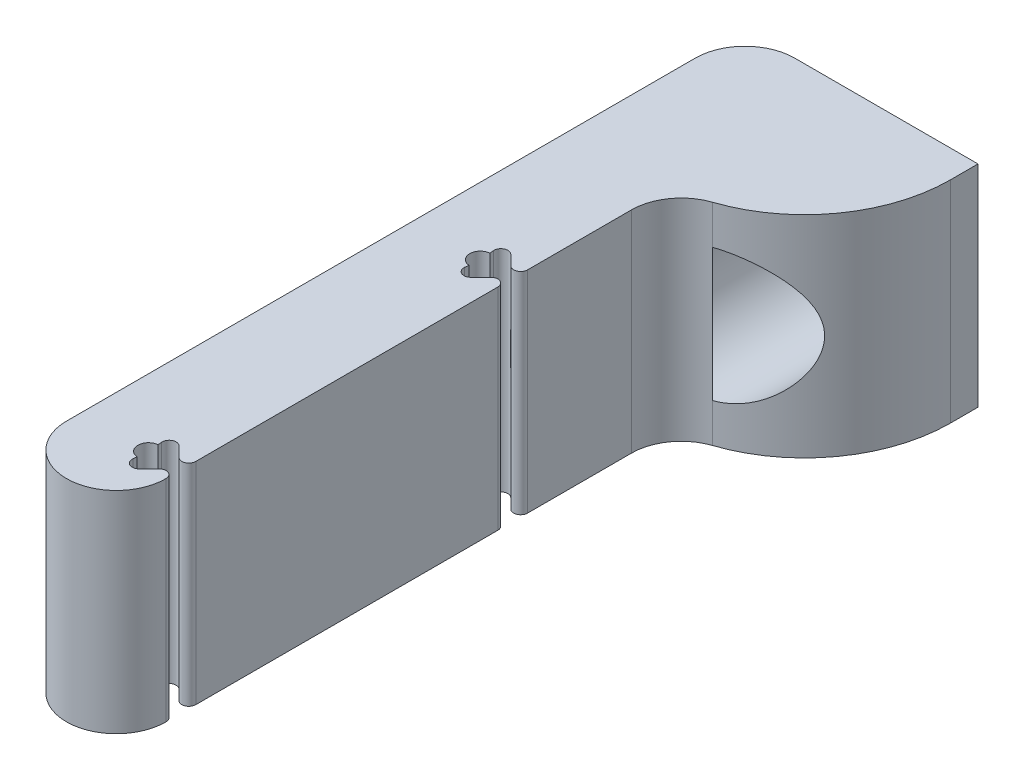
ISO-10303-21;
HEADER;
FILE_DESCRIPTION(('STEP AP214'),'2;1');
FILE_NAME('part.step','',(''),(''),'','','');
FILE_SCHEMA(('AUTOMOTIVE_DESIGN { 1 0 10303 214 1 1 1 1 }'));
ENDSEC;
DATA;
#1=APPLICATION_CONTEXT('core data for automotive mechanical design processes');
#2=APPLICATION_PROTOCOL_DEFINITION('international standard','automotive_design',2000,#1);
#3=PRODUCT_CONTEXT('',#1,'mechanical');
#4=PRODUCT('Part','Part','',(#3));
#5=PRODUCT_RELATED_PRODUCT_CATEGORY('part','',(#4));
#6=PRODUCT_DEFINITION_FORMATION('','',#4);
#7=PRODUCT_DEFINITION_CONTEXT('part definition',#1,'design');
#8=PRODUCT_DEFINITION('design','',#6,#7);
#9=PRODUCT_DEFINITION_SHAPE('','',#8);
#10=(LENGTH_UNIT() NAMED_UNIT(*) SI_UNIT(.MILLI.,.METRE.));
#11=(NAMED_UNIT(*) PLANE_ANGLE_UNIT() SI_UNIT($,.RADIAN.));
#12=(NAMED_UNIT(*) SI_UNIT($,.STERADIAN.) SOLID_ANGLE_UNIT());
#13=UNCERTAINTY_MEASURE_WITH_UNIT(LENGTH_MEASURE(1.E-05),#10,'distance_accuracy_value','');
#14=(GEOMETRIC_REPRESENTATION_CONTEXT(3) GLOBAL_UNCERTAINTY_ASSIGNED_CONTEXT((#13)) GLOBAL_UNIT_ASSIGNED_CONTEXT((#10,
#11,#12)) REPRESENTATION_CONTEXT('',''));
#15=CARTESIAN_POINT('',(0.,0.,0.));
#16=DIRECTION('',(0.,0.,1.));
#17=DIRECTION('',(1.,0.,0.));
#18=AXIS2_PLACEMENT_3D('',#15,#16,#17);
#19=CARTESIAN_POINT('',(-4.,12.7,0.));
#20=DIRECTION('',(0.,-1.,0.));
#21=DIRECTION('',(0.,0.,-1.));
#22=AXIS2_PLACEMENT_3D('',#19,#20,#21);
#23=CYLINDRICAL_SURFACE('',#22,0.635);
#24=CARTESIAN_POINT('',(-4.,0.,0.));
#25=DIRECTION('',(0.,-1.,0.));
#26=DIRECTION('',(0.,0.,1.));
#27=AXIS2_PLACEMENT_3D('',#24,#25,#26);
#28=CIRCLE('',#27,0.635);
#29=CARTESIAN_POINT('',(-4.05534389664477,0.,0.632583633288259));
#30=VERTEX_POINT('',#29);
#31=CARTESIAN_POINT('',(-4.05534389664477,0.,-0.632583633288257));
#32=VERTEX_POINT('',#31);
#33=EDGE_CURVE('E263',#30,#32,#28,.T.);
#34=ORIENTED_EDGE('',*,*,#33,.T.);
#35=DIRECTION('',(0.,-1.,0.));
#36=VECTOR('',#35,1.);
#37=CARTESIAN_POINT('',(-4.05534389664477,12.7,-0.632583633288257));
#38=LINE('',#37,#36);
#39=CARTESIAN_POINT('',(-4.05534389664477,12.7,-0.632583633288257));
#40=VERTEX_POINT('',#39);
#41=EDGE_CURVE('E11',#40,#32,#38,.T.);
#42=ORIENTED_EDGE('',*,*,#41,.F.);
#43=CARTESIAN_POINT('',(-4.,12.7,0.));
#44=DIRECTION('',(0.,-1.,0.));
#45=DIRECTION('',(0.,0.,1.));
#46=AXIS2_PLACEMENT_3D('',#43,#44,#45);
#47=CIRCLE('',#46,0.635);
#48=CARTESIAN_POINT('',(-4.05534389664477,12.7,0.632583633288259));
#49=VERTEX_POINT('',#48);
#50=EDGE_CURVE('E345',#49,#40,#47,.T.);
#51=ORIENTED_EDGE('',*,*,#50,.F.);
#52=DIRECTION('',(0.,-1.,0.));
#53=VECTOR('',#52,1.);
#54=CARTESIAN_POINT('',(-4.05534389664477,12.7,0.632583633288259));
#55=LINE('',#54,#53);
#56=EDGE_CURVE('E259',#49,#30,#55,.T.);
#57=ORIENTED_EDGE('',*,*,#56,.T.);
#58=EDGE_LOOP('',(#34,#42,#51,#57));
#59=FACE_BOUND('',#58,.T.);
#60=ADVANCED_FACE('F39',(#59),#23,.F.);
#61=CARTESIAN_POINT('',(-4.05534389664477,12.7,-0.632583633288257));
#62=DIRECTION('',(-0.996194698091745,0.,0.0871557427476669));
#63=DIRECTION('',(0.0871557427476669,0.,0.996194698091745));
#64=AXIS2_PLACEMENT_3D('',#61,#62,#63);
#65=PLANE('',#64);
#66=DIRECTION('',(-0.087155742747667,0.,-0.996194698091745));
#67=VECTOR('',#66,1.);
#68=CARTESIAN_POINT('',(-4.05534389664477,0.,-0.632583633288257));
#69=LINE('',#68,#67);
#70=CARTESIAN_POINT('',(-4.07584445948414,0.,-0.866906138778301));
#71=VERTEX_POINT('',#70);
#72=EDGE_CURVE('E267',#32,#71,#69,.T.);
#73=ORIENTED_EDGE('',*,*,#72,.T.);
#74=DIRECTION('',(0.,-1.,0.));
#75=VECTOR('',#74,1.);
#76=CARTESIAN_POINT('',(-4.07584445948414,12.7,-0.866906138778301));
#77=LINE('',#76,#75);
#78=CARTESIAN_POINT('',(-4.07584445948414,12.7,-0.866906138778301));
#79=VERTEX_POINT('',#78);
#80=EDGE_CURVE('E47',#79,#71,#77,.T.);
#81=ORIENTED_EDGE('',*,*,#80,.F.);
#82=DIRECTION('',(-0.087155742747667,0.,-0.996194698091745));
#83=VECTOR('',#82,1.);
#84=CARTESIAN_POINT('',(-4.05534389664477,12.7,-0.632583633288257));
#85=LINE('',#84,#83);
#86=EDGE_CURVE('E160',#40,#79,#85,.T.);
#87=ORIENTED_EDGE('',*,*,#86,.F.);
#88=ORIENTED_EDGE('',*,*,#41,.T.);
#89=EDGE_LOOP('',(#73,#81,#87,#88));
#90=FACE_BOUND('',#89,.T.);
#91=ADVANCED_FACE('F598',(#90),#65,.F.);
#92=CARTESIAN_POINT('',(-3.65806528884882,12.7,-0.903457080066158));
#93=DIRECTION('',(0.,-1.,0.));
#94=DIRECTION('',(0.,0.,-1.));
#95=AXIS2_PLACEMENT_3D('',#92,#93,#94);
#96=CYLINDRICAL_SURFACE('',#95,0.419375019196146);
#97=CARTESIAN_POINT('',(-3.65806528884882,0.,-0.903457080066158));
#98=DIRECTION('',(0.,-1.,0.));
#99=DIRECTION('',(0.,0.,-1.));
#100=AXIS2_PLACEMENT_3D('',#97,#98,#99);
#101=CIRCLE('',#100,0.419375019196146);
#102=CARTESIAN_POINT('',(-3.36152236891499,0.,-1.2));
#103=VERTEX_POINT('',#102);
#104=EDGE_CURVE('E271',#71,#103,#101,.T.);
#105=ORIENTED_EDGE('',*,*,#104,.T.);
#106=DIRECTION('',(0.,-1.,0.));
#107=VECTOR('',#106,1.);
#108=CARTESIAN_POINT('',(-3.36152236891499,12.7,-1.2));
#109=LINE('',#108,#107);
#110=CARTESIAN_POINT('',(-3.36152236891499,12.7,-1.2));
#111=VERTEX_POINT('',#110);
#112=EDGE_CURVE('E434',#111,#103,#109,.T.);
#113=ORIENTED_EDGE('',*,*,#112,.F.);
#114=CARTESIAN_POINT('',(-3.65806528884882,12.7,-0.903457080066158));
#115=DIRECTION('',(0.,-1.,0.));
#116=DIRECTION('',(0.,0.,-1.));
#117=AXIS2_PLACEMENT_3D('',#114,#115,#116);
#118=CIRCLE('',#117,0.419375019196146);
#119=EDGE_CURVE('E444',#79,#111,#118,.T.);
#120=ORIENTED_EDGE('',*,*,#119,.F.);
#121=ORIENTED_EDGE('',*,*,#80,.T.);
#122=EDGE_LOOP('',(#105,#113,#120,#121));
#123=FACE_BOUND('',#122,.T.);
#124=ADVANCED_FACE('F442',(#123),#96,.F.);
#125=CARTESIAN_POINT('',(-3.36152236891499,12.7,-1.2));
#126=DIRECTION('',(0.707106781186529,0.,-0.707106781186566));
#127=DIRECTION('',(-0.707106781186566,0.,-0.707106781186529));
#128=AXIS2_PLACEMENT_3D('',#125,#126,#127);
#129=PLANE('',#128);
#130=DIRECTION('',(0.707106781186566,0.,0.707106781186529));
#131=VECTOR('',#130,1.);
#132=CARTESIAN_POINT('',(-3.36152236891499,0.,-1.2));
#133=LINE('',#132,#131);
#134=CARTESIAN_POINT('',(-2.76152236891496,0.,-0.6));
#135=VERTEX_POINT('',#134);
#136=EDGE_CURVE('E274',#103,#135,#133,.T.);
#137=ORIENTED_EDGE('',*,*,#136,.T.);
#138=DIRECTION('',(0.,-1.,0.));
#139=VECTOR('',#138,1.);
#140=CARTESIAN_POINT('',(-2.76152236891496,12.7,-0.6));
#141=LINE('',#140,#139);
#142=CARTESIAN_POINT('',(-2.76152236891496,12.7,-0.6));
#143=VERTEX_POINT('',#142);
#144=EDGE_CURVE('E430',#143,#135,#141,.T.);
#145=ORIENTED_EDGE('',*,*,#144,.F.);
#146=DIRECTION('',(0.707106781186566,0.,0.707106781186529));
#147=VECTOR('',#146,1.);
#148=CARTESIAN_POINT('',(-3.36152236891499,12.7,-1.2));
#149=LINE('',#148,#147);
#150=EDGE_CURVE('E463',#111,#143,#149,.T.);
#151=ORIENTED_EDGE('',*,*,#150,.F.);
#152=ORIENTED_EDGE('',*,*,#112,.T.);
#153=EDGE_LOOP('',(#137,#145,#151,#152));
#154=FACE_BOUND('',#153,.T.);
#155=ADVANCED_FACE('F453',(#154),#129,.F.);
#156=CARTESIAN_POINT('',(-2.46497944898113,12.7,-0.896542919933841));
#157=DIRECTION('',(0.,-1.,0.));
#158=DIRECTION('',(0.,0.,-1.));
#159=AXIS2_PLACEMENT_3D('',#156,#157,#158);
#160=CYLINDRICAL_SURFACE('',#159,0.419375019196148);
#161=CARTESIAN_POINT('',(-2.46497944898113,0.,-0.896542919933841));
#162=DIRECTION('',(0.,1.,0.));
#163=DIRECTION('',(0.,0.,1.));
#164=AXIS2_PLACEMENT_3D('',#161,#162,#163);
#165=CIRCLE('',#164,0.419375019196148);
#166=CARTESIAN_POINT('',(-2.04560442978499,0.,-0.896542919933841));
#167=VERTEX_POINT('',#166);
#168=EDGE_CURVE('E277',#135,#167,#165,.T.);
#169=ORIENTED_EDGE('',*,*,#168,.T.);
#170=DIRECTION('',(0.,-1.,0.));
#171=VECTOR('',#170,1.);
#172=CARTESIAN_POINT('',(-2.04560442978499,12.7,-0.896542919933841));
#173=LINE('',#172,#171);
#174=CARTESIAN_POINT('',(-2.04560442978499,12.7,-0.896542919933841));
#175=VERTEX_POINT('',#174);
#176=EDGE_CURVE('E426',#175,#167,#173,.T.);
#177=ORIENTED_EDGE('',*,*,#176,.F.);
#178=CARTESIAN_POINT('',(-2.46497944898113,12.7,-0.896542919933841));
#179=DIRECTION('',(0.,1.,0.));
#180=DIRECTION('',(0.,0.,1.));
#181=AXIS2_PLACEMENT_3D('',#178,#179,#180);
#182=CIRCLE('',#181,0.419375019196148);
#183=EDGE_CURVE('E459',#143,#175,#182,.T.);
#184=ORIENTED_EDGE('',*,*,#183,.F.);
#185=ORIENTED_EDGE('',*,*,#144,.T.);
#186=EDGE_LOOP('',(#169,#177,#184,#185));
#187=FACE_BOUND('',#186,.T.);
#188=ADVANCED_FACE('F457',(#187),#160,.T.);
#189=CARTESIAN_POINT('',(-2.04560442978506,12.7,-19.1034570800662));
#190=DIRECTION('',(-1.,0.,0.));
#191=DIRECTION('',(0.,0.,1.));
#192=AXIS2_PLACEMENT_3D('',#189,#190,#191);
#193=PLANE('',#192);
#194=DIRECTION('',(0.,0.,-1.));
#195=VECTOR('',#194,1.);
#196=CARTESIAN_POINT('',(-2.04560442978506,0.,-19.1034570800662));
#197=LINE('',#196,#195);
#198=CARTESIAN_POINT('',(-2.04560442978506,0.,-19.1034570800662));
#199=VERTEX_POINT('',#198);
#200=EDGE_CURVE('E280',#167,#199,#197,.T.);
#201=ORIENTED_EDGE('',*,*,#200,.T.);
#202=DIRECTION('',(0.,-1.,0.));
#203=VECTOR('',#202,1.);
#204=CARTESIAN_POINT('',(-2.04560442978506,12.7,-19.1034570800662));
#205=LINE('',#204,#203);
#206=CARTESIAN_POINT('',(-2.04560442978506,12.7,-19.1034570800662));
#207=VERTEX_POINT('',#206);
#208=EDGE_CURVE('E422',#207,#199,#205,.T.);
#209=ORIENTED_EDGE('',*,*,#208,.F.);
#210=DIRECTION('',(0.,0.,-1.));
#211=VECTOR('',#210,1.);
#212=CARTESIAN_POINT('',(-2.04560442978506,12.7,-19.1034570800662));
#213=LINE('',#212,#211);
#214=EDGE_CURVE('E462',#175,#207,#213,.T.);
#215=ORIENTED_EDGE('',*,*,#214,.F.);
#216=ORIENTED_EDGE('',*,*,#176,.T.);
#217=EDGE_LOOP('',(#201,#209,#215,#216));
#218=FACE_BOUND('',#217,.T.);
#219=ADVANCED_FACE('F611',(#218),#193,.F.);
#220=CARTESIAN_POINT('',(-2.4649794489812,12.7,-19.1034570800662));
#221=DIRECTION('',(0.,-1.,0.));
#222=DIRECTION('',(0.,0.,-1.));
#223=AXIS2_PLACEMENT_3D('',#220,#221,#222);
#224=CYLINDRICAL_SURFACE('',#223,0.419375019196147);
#225=CARTESIAN_POINT('',(-2.4649794489812,0.,-19.1034570800662));
#226=DIRECTION('',(0.,1.,0.));
#227=DIRECTION('',(0.,0.,-1.));
#228=AXIS2_PLACEMENT_3D('',#225,#226,#227);
#229=CIRCLE('',#228,0.419375019196147);
#230=CARTESIAN_POINT('',(-2.76152236891503,0.,-19.4));
#231=VERTEX_POINT('',#230);
#232=EDGE_CURVE('E283',#199,#231,#229,.T.);
#233=ORIENTED_EDGE('',*,*,#232,.T.);
#234=DIRECTION('',(0.,-1.,0.));
#235=VECTOR('',#234,1.);
#236=CARTESIAN_POINT('',(-2.76152236891503,12.7,-19.4));
#237=LINE('',#236,#235);
#238=CARTESIAN_POINT('',(-2.76152236891503,12.7,-19.4));
#239=VERTEX_POINT('',#238);
#240=EDGE_CURVE('E418',#239,#231,#237,.T.);
#241=ORIENTED_EDGE('',*,*,#240,.F.);
#242=CARTESIAN_POINT('',(-2.4649794489812,12.7,-19.1034570800662));
#243=DIRECTION('',(0.,1.,0.));
#244=DIRECTION('',(0.,0.,-1.));
#245=AXIS2_PLACEMENT_3D('',#242,#243,#244);
#246=CIRCLE('',#245,0.419375019196147);
#247=EDGE_CURVE('E467',#207,#239,#246,.T.);
#248=ORIENTED_EDGE('',*,*,#247,.F.);
#249=ORIENTED_EDGE('',*,*,#208,.T.);
#250=EDGE_LOOP('',(#233,#241,#248,#249));
#251=FACE_BOUND('',#250,.T.);
#252=ADVANCED_FACE('F614',(#251),#224,.T.);
#253=CARTESIAN_POINT('',(-3.36152236891506,12.7,-18.8));
#254=DIRECTION('',(0.70710678118653,0.,0.707106781186565));
#255=DIRECTION('',(0.707106781186565,0.,-0.70710678118653));
#256=AXIS2_PLACEMENT_3D('',#253,#254,#255);
#257=PLANE('',#256);
#258=DIRECTION('',(-0.707106781186565,0.,0.70710678118653));
#259=VECTOR('',#258,1.);
#260=CARTESIAN_POINT('',(-3.36152236891506,0.,-18.8));
#261=LINE('',#260,#259);
#262=CARTESIAN_POINT('',(-3.36152236891506,0.,-18.8));
#263=VERTEX_POINT('',#262);
#264=EDGE_CURVE('E286',#231,#263,#261,.T.);
#265=ORIENTED_EDGE('',*,*,#264,.T.);
#266=DIRECTION('',(0.,-1.,0.));
#267=VECTOR('',#266,1.);
#268=CARTESIAN_POINT('',(-3.36152236891506,12.7,-18.8));
#269=LINE('',#268,#267);
#270=CARTESIAN_POINT('',(-3.36152236891506,12.7,-18.8));
#271=VERTEX_POINT('',#270);
#272=EDGE_CURVE('E414',#271,#263,#269,.T.);
#273=ORIENTED_EDGE('',*,*,#272,.F.);
#274=DIRECTION('',(-0.707106781186565,0.,0.70710678118653));
#275=VECTOR('',#274,1.);
#276=CARTESIAN_POINT('',(-3.36152236891506,12.7,-18.8));
#277=LINE('',#276,#275);
#278=EDGE_CURVE('E474',#239,#271,#277,.T.);
#279=ORIENTED_EDGE('',*,*,#278,.F.);
#280=ORIENTED_EDGE('',*,*,#240,.T.);
#281=EDGE_LOOP('',(#265,#273,#279,#280));
#282=FACE_BOUND('',#281,.T.);
#283=ADVANCED_FACE('F618',(#282),#257,.F.);
#284=CARTESIAN_POINT('',(-3.65806528884889,12.7,-19.0965429199338));
#285=DIRECTION('',(0.,-1.,0.));
#286=DIRECTION('',(0.,0.,-1.));
#287=AXIS2_PLACEMENT_3D('',#284,#285,#286);
#288=CYLINDRICAL_SURFACE('',#287,0.419375019196147);
#289=CARTESIAN_POINT('',(-3.65806528884889,0.,-19.0965429199338));
#290=DIRECTION('',(0.,-1.,0.));
#291=DIRECTION('',(0.,0.,1.));
#292=AXIS2_PLACEMENT_3D('',#289,#290,#291);
#293=CIRCLE('',#292,0.419375019196147);
#294=CARTESIAN_POINT('',(-4.07584445948421,0.,-19.1330938612217));
#295=VERTEX_POINT('',#294);
#296=EDGE_CURVE('E289',#263,#295,#293,.T.);
#297=ORIENTED_EDGE('',*,*,#296,.T.);
#298=DIRECTION('',(0.,-1.,0.));
#299=VECTOR('',#298,1.);
#300=CARTESIAN_POINT('',(-4.07584445948421,12.7,-19.1330938612217));
#301=LINE('',#300,#299);
#302=CARTESIAN_POINT('',(-4.07584445948421,12.7,-19.1330938612217));
#303=VERTEX_POINT('',#302);
#304=EDGE_CURVE('E410',#303,#295,#301,.T.);
#305=ORIENTED_EDGE('',*,*,#304,.F.);
#306=CARTESIAN_POINT('',(-3.65806528884889,12.7,-19.0965429199338));
#307=DIRECTION('',(0.,-1.,0.));
#308=DIRECTION('',(0.,0.,1.));
#309=AXIS2_PLACEMENT_3D('',#306,#307,#308);
#310=CIRCLE('',#309,0.419375019196147);
#311=EDGE_CURVE('E477',#271,#303,#310,.T.);
#312=ORIENTED_EDGE('',*,*,#311,.F.);
#313=ORIENTED_EDGE('',*,*,#272,.T.);
#314=EDGE_LOOP('',(#297,#305,#312,#313));
#315=FACE_BOUND('',#314,.T.);
#316=ADVANCED_FACE('F622',(#315),#288,.F.);
#317=CARTESIAN_POINT('',(-4.05534389664484,12.7,-19.3674163667117));
#318=DIRECTION('',(-0.996194698091745,0.,-0.0871557427476669));
#319=DIRECTION('',(-0.0871557427476668,0.,0.996194698091745));
#320=AXIS2_PLACEMENT_3D('',#317,#318,#319);
#321=PLANE('',#320);
#322=DIRECTION('',(0.0871557427476668,0.,-0.996194698091745));
#323=VECTOR('',#322,1.);
#324=CARTESIAN_POINT('',(-4.05534389664484,0.,-19.3674163667117));
#325=LINE('',#324,#323);
#326=CARTESIAN_POINT('',(-4.05534389664484,0.,-19.3674163667117));
#327=VERTEX_POINT('',#326);
#328=EDGE_CURVE('E292',#295,#327,#325,.T.);
#329=ORIENTED_EDGE('',*,*,#328,.T.);
#330=DIRECTION('',(0.,-1.,0.));
#331=VECTOR('',#330,1.);
#332=CARTESIAN_POINT('',(-4.05534389664484,12.7,-19.3674163667117));
#333=LINE('',#332,#331);
#334=CARTESIAN_POINT('',(-4.05534389664484,12.7,-19.3674163667117));
#335=VERTEX_POINT('',#334);
#336=EDGE_CURVE('E406',#335,#327,#333,.T.);
#337=ORIENTED_EDGE('',*,*,#336,.F.);
#338=DIRECTION('',(0.0871557427476668,0.,-0.996194698091745));
#339=VECTOR('',#338,1.);
#340=CARTESIAN_POINT('',(-4.05534389664484,12.7,-19.3674163667117));
#341=LINE('',#340,#339);
#342=EDGE_CURVE('E480',#303,#335,#341,.T.);
#343=ORIENTED_EDGE('',*,*,#342,.F.);
#344=ORIENTED_EDGE('',*,*,#304,.T.);
#345=EDGE_LOOP('',(#329,#337,#343,#344));
#346=FACE_BOUND('',#345,.T.);
#347=ADVANCED_FACE('F626',(#346),#321,.F.);
#348=CARTESIAN_POINT('',(-4.00000000000007,12.7,-20.));
#349=DIRECTION('',(0.,-1.,0.));
#350=DIRECTION('',(0.,0.,-1.));
#351=AXIS2_PLACEMENT_3D('',#348,#349,#350);
#352=CYLINDRICAL_SURFACE('',#351,0.635);
#353=CARTESIAN_POINT('',(-4.00000000000007,0.,-20.));
#354=DIRECTION('',(0.,-1.,0.));
#355=DIRECTION('',(0.,0.,1.));
#356=AXIS2_PLACEMENT_3D('',#353,#354,#355);
#357=CIRCLE('',#356,0.635);
#358=CARTESIAN_POINT('',(-4.05534389664484,0.,-20.6325836332883));
#359=VERTEX_POINT('',#358);
#360=EDGE_CURVE('E295',#327,#359,#357,.T.);
#361=ORIENTED_EDGE('',*,*,#360,.T.);
#362=DIRECTION('',(0.,-1.,0.));
#363=VECTOR('',#362,1.);
#364=CARTESIAN_POINT('',(-4.05534389664484,12.7,-20.6325836332883));
#365=LINE('',#364,#363);
#366=CARTESIAN_POINT('',(-4.05534389664484,12.7,-20.6325836332883));
#367=VERTEX_POINT('',#366);
#368=EDGE_CURVE('E402',#367,#359,#365,.T.);
#369=ORIENTED_EDGE('',*,*,#368,.F.);
#370=CARTESIAN_POINT('',(-4.00000000000007,12.7,-20.));
#371=DIRECTION('',(0.,-1.,0.));
#372=DIRECTION('',(0.,0.,1.));
#373=AXIS2_PLACEMENT_3D('',#370,#371,#372);
#374=CIRCLE('',#373,0.635);
#375=EDGE_CURVE('E483',#335,#367,#374,.T.);
#376=ORIENTED_EDGE('',*,*,#375,.F.);
#377=ORIENTED_EDGE('',*,*,#336,.T.);
#378=EDGE_LOOP('',(#361,#369,#376,#377));
#379=FACE_BOUND('',#378,.T.);
#380=ADVANCED_FACE('F630',(#379),#352,.F.);
#381=CARTESIAN_POINT('',(-4.05534389664484,12.7,-20.6325836332883));
#382=DIRECTION('',(-0.996194698091745,0.,0.0871557427476669));
#383=DIRECTION('',(0.0871557427476668,0.,0.996194698091745));
#384=AXIS2_PLACEMENT_3D('',#381,#382,#383);
#385=PLANE('',#384);
#386=DIRECTION('',(-0.0871557427476668,0.,-0.996194698091745));
#387=VECTOR('',#386,1.);
#388=CARTESIAN_POINT('',(-4.05534389664484,0.,-20.6325836332883));
#389=LINE('',#388,#387);
#390=CARTESIAN_POINT('',(-4.07584445948421,0.,-20.8669061387783));
#391=VERTEX_POINT('',#390);
#392=EDGE_CURVE('E298',#359,#391,#389,.T.);
#393=ORIENTED_EDGE('',*,*,#392,.T.);
#394=DIRECTION('',(0.,-1.,0.));
#395=VECTOR('',#394,1.);
#396=CARTESIAN_POINT('',(-4.07584445948421,12.7,-20.8669061387783));
#397=LINE('',#396,#395);
#398=CARTESIAN_POINT('',(-4.07584445948421,12.7,-20.8669061387783));
#399=VERTEX_POINT('',#398);
#400=EDGE_CURVE('E398',#399,#391,#397,.T.);
#401=ORIENTED_EDGE('',*,*,#400,.F.);
#402=DIRECTION('',(-0.0871557427476668,0.,-0.996194698091745));
#403=VECTOR('',#402,1.);
#404=CARTESIAN_POINT('',(-4.05534389664484,12.7,-20.6325836332883));
#405=LINE('',#404,#403);
#406=EDGE_CURVE('E486',#367,#399,#405,.T.);
#407=ORIENTED_EDGE('',*,*,#406,.F.);
#408=ORIENTED_EDGE('',*,*,#368,.T.);
#409=EDGE_LOOP('',(#393,#401,#407,#408));
#410=FACE_BOUND('',#409,.T.);
#411=ADVANCED_FACE('F634',(#410),#385,.F.);
#412=CARTESIAN_POINT('',(-3.65806528884889,12.7,-20.9034570800662));
#413=DIRECTION('',(0.,-1.,0.));
#414=DIRECTION('',(0.,0.,-1.));
#415=AXIS2_PLACEMENT_3D('',#412,#413,#414);
#416=CYLINDRICAL_SURFACE('',#415,0.419375019196146);
#417=CARTESIAN_POINT('',(-3.65806528884889,0.,-20.9034570800662));
#418=DIRECTION('',(0.,-1.,0.));
#419=DIRECTION('',(0.,0.,-1.));
#420=AXIS2_PLACEMENT_3D('',#417,#418,#419);
#421=CIRCLE('',#420,0.419375019196146);
#422=CARTESIAN_POINT('',(-3.36152236891506,0.,-21.2));
#423=VERTEX_POINT('',#422);
#424=EDGE_CURVE('E301',#391,#423,#421,.T.);
#425=ORIENTED_EDGE('',*,*,#424,.T.);
#426=DIRECTION('',(0.,-1.,0.));
#427=VECTOR('',#426,1.);
#428=CARTESIAN_POINT('',(-3.36152236891506,12.7,-21.2));
#429=LINE('',#428,#427);
#430=CARTESIAN_POINT('',(-3.36152236891506,12.7,-21.2));
#431=VERTEX_POINT('',#430);
#432=EDGE_CURVE('E394',#431,#423,#429,.T.);
#433=ORIENTED_EDGE('',*,*,#432,.F.);
#434=CARTESIAN_POINT('',(-3.65806528884889,12.7,-20.9034570800662));
#435=DIRECTION('',(0.,-1.,0.));
#436=DIRECTION('',(0.,0.,-1.));
#437=AXIS2_PLACEMENT_3D('',#434,#435,#436);
#438=CIRCLE('',#437,0.419375019196146);
#439=EDGE_CURVE('E489',#399,#431,#438,.T.);
#440=ORIENTED_EDGE('',*,*,#439,.F.);
#441=ORIENTED_EDGE('',*,*,#400,.T.);
#442=EDGE_LOOP('',(#425,#433,#440,#441));
#443=FACE_BOUND('',#442,.T.);
#444=ADVANCED_FACE('F638',(#443),#416,.F.);
#445=CARTESIAN_POINT('',(-3.36152236891506,12.7,-21.2));
#446=DIRECTION('',(0.707106781186529,0.,-0.707106781186565));
#447=DIRECTION('',(-0.707106781186566,0.,-0.70710678118653));
#448=AXIS2_PLACEMENT_3D('',#445,#446,#447);
#449=PLANE('',#448);
#450=DIRECTION('',(0.707106781186565,0.,0.70710678118653));
#451=VECTOR('',#450,1.);
#452=CARTESIAN_POINT('',(-3.36152236891506,0.,-21.2));
#453=LINE('',#452,#451);
#454=CARTESIAN_POINT('',(-2.76152236891503,0.,-20.6));
#455=VERTEX_POINT('',#454);
#456=EDGE_CURVE('E304',#423,#455,#453,.T.);
#457=ORIENTED_EDGE('',*,*,#456,.T.);
#458=DIRECTION('',(0.,-1.,0.));
#459=VECTOR('',#458,1.);
#460=CARTESIAN_POINT('',(-2.76152236891503,12.7,-20.6));
#461=LINE('',#460,#459);
#462=CARTESIAN_POINT('',(-2.76152236891503,12.7,-20.6));
#463=VERTEX_POINT('',#462);
#464=EDGE_CURVE('E390',#463,#455,#461,.T.);
#465=ORIENTED_EDGE('',*,*,#464,.F.);
#466=DIRECTION('',(0.707106781186565,0.,0.70710678118653));
#467=VECTOR('',#466,1.);
#468=CARTESIAN_POINT('',(-3.36152236891506,12.7,-21.2));
#469=LINE('',#468,#467);
#470=EDGE_CURVE('E492',#431,#463,#469,.T.);
#471=ORIENTED_EDGE('',*,*,#470,.F.);
#472=ORIENTED_EDGE('',*,*,#432,.T.);
#473=EDGE_LOOP('',(#457,#465,#471,#472));
#474=FACE_BOUND('',#473,.T.);
#475=ADVANCED_FACE('F642',(#474),#449,.F.);
#476=CARTESIAN_POINT('',(-2.4649794489812,12.7,-20.8965429199338));
#477=DIRECTION('',(0.,-1.,0.));
#478=DIRECTION('',(0.,0.,-1.));
#479=AXIS2_PLACEMENT_3D('',#476,#477,#478);
#480=CYLINDRICAL_SURFACE('',#479,0.419375019196147);
#481=CARTESIAN_POINT('',(-2.4649794489812,0.,-20.8965429199338));
#482=DIRECTION('',(0.,1.,0.));
#483=DIRECTION('',(0.,0.,1.));
#484=AXIS2_PLACEMENT_3D('',#481,#482,#483);
#485=CIRCLE('',#484,0.419375019196147);
#486=CARTESIAN_POINT('',(-2.04560442978506,0.,-20.8965429199338));
#487=VERTEX_POINT('',#486);
#488=EDGE_CURVE('E307',#455,#487,#485,.T.);
#489=ORIENTED_EDGE('',*,*,#488,.T.);
#490=DIRECTION('',(0.,-1.,0.));
#491=VECTOR('',#490,1.);
#492=CARTESIAN_POINT('',(-2.04560442978506,12.7,-20.8965429199338));
#493=LINE('',#492,#491);
#494=CARTESIAN_POINT('',(-2.04560442978506,12.7,-20.8965429199338));
#495=VERTEX_POINT('',#494);
#496=EDGE_CURVE('E386',#495,#487,#493,.T.);
#497=ORIENTED_EDGE('',*,*,#496,.F.);
#498=CARTESIAN_POINT('',(-2.4649794489812,12.7,-20.8965429199338));
#499=DIRECTION('',(0.,1.,0.));
#500=DIRECTION('',(0.,0.,1.));
#501=AXIS2_PLACEMENT_3D('',#498,#499,#500);
#502=CIRCLE('',#501,0.419375019196147);
#503=EDGE_CURVE('E495',#463,#495,#502,.T.);
#504=ORIENTED_EDGE('',*,*,#503,.F.);
#505=ORIENTED_EDGE('',*,*,#464,.T.);
#506=EDGE_LOOP('',(#489,#497,#504,#505));
#507=FACE_BOUND('',#506,.T.);
#508=ADVANCED_FACE('F646',(#507),#480,.T.);
#509=CARTESIAN_POINT('',(-2.04560442978506,12.7,-20.8965429199338));
#510=DIRECTION('',(-1.,0.,0.));
#511=DIRECTION('',(0.,0.,1.));
#512=AXIS2_PLACEMENT_3D('',#509,#510,#511);
#513=PLANE('',#512);
#514=DIRECTION('',(0.,0.,-1.));
#515=VECTOR('',#514,1.);
#516=CARTESIAN_POINT('',(-2.04560442978506,0.,-20.8965429199338));
#517=LINE('',#516,#515);
#518=CARTESIAN_POINT('',(-2.04560442978499,0.,-27.1558605703036));
#519=VERTEX_POINT('',#518);
#520=EDGE_CURVE('E310',#487,#519,#517,.T.);
#521=ORIENTED_EDGE('',*,*,#520,.T.);
#522=DIRECTION('',(0.,-1.,0.));
#523=VECTOR('',#522,1.);
#524=CARTESIAN_POINT('',(-2.04560442978499,12.7,-27.1558605703036));
#525=LINE('',#524,#523);
#526=CARTESIAN_POINT('',(-2.04560442978499,12.7,-27.1558605703036));
#527=VERTEX_POINT('',#526);
#528=EDGE_CURVE('E381',#527,#519,#525,.T.);
#529=ORIENTED_EDGE('',*,*,#528,.F.);
#530=DIRECTION('',(0.,0.,-1.));
#531=VECTOR('',#530,1.);
#532=CARTESIAN_POINT('',(-2.04560442978506,12.7,-20.8965429199338));
#533=LINE('',#532,#531);
#534=EDGE_CURVE('E498',#495,#527,#533,.T.);
#535=ORIENTED_EDGE('',*,*,#534,.F.);
#536=ORIENTED_EDGE('',*,*,#496,.T.);
#537=EDGE_LOOP('',(#521,#529,#535,#536));
#538=FACE_BOUND('',#537,.T.);
#539=ADVANCED_FACE('F650',(#538),#513,.F.);
#540=CARTESIAN_POINT('',(0.954395570215008,12.7,-27.1558605703036));
#541=DIRECTION('',(0.,-1.,0.));
#542=DIRECTION('',(0.,0.,-1.));
#543=AXIS2_PLACEMENT_3D('',#540,#541,#542);
#544=CYLINDRICAL_SURFACE('',#543,3.);
#545=CARTESIAN_POINT('',(0.954395570215008,0.,-27.1558605703036));
#546=DIRECTION('',(0.,-1.,0.));
#547=DIRECTION('',(0.,0.,-1.));
#548=AXIS2_PLACEMENT_3D('',#545,#546,#547);
#549=CIRCLE('',#548,3.);
#550=CARTESIAN_POINT('',(0.,0.,-30.));
#551=VERTEX_POINT('',#550);
#552=EDGE_CURVE('E313',#519,#551,#549,.T.);
#553=ORIENTED_EDGE('',*,*,#552,.T.);
#554=DIRECTION('',(0.,-1.,0.));
#555=VECTOR('',#554,1.);
#556=CARTESIAN_POINT('',(0.,12.7,-30.));
#557=LINE('',#556,#555);
#558=CARTESIAN_POINT('',(0.,2.35,-30.));
#559=VERTEX_POINT('',#558);
#560=EDGE_CURVE('E376',#559,#551,#557,.T.);
#561=ORIENTED_EDGE('',*,*,#560,.F.);
#562=CARTESIAN_POINT('',(0.,10.35,-30.));
#563=VERTEX_POINT('',#562);
#564=EDGE_CURVE('E382',#563,#559,#557,.T.);
#565=ORIENTED_EDGE('',*,*,#564,.F.);
#566=CARTESIAN_POINT('',(0.,12.7,-30.));
#567=VERTEX_POINT('',#566);
#568=EDGE_CURVE('E377',#567,#563,#557,.T.);
#569=ORIENTED_EDGE('',*,*,#568,.F.);
#570=CARTESIAN_POINT('',(0.954395570215008,12.7,-27.1558605703036));
#571=DIRECTION('',(0.,-1.,0.));
#572=DIRECTION('',(0.,0.,-1.));
#573=AXIS2_PLACEMENT_3D('',#570,#571,#572);
#574=CIRCLE('',#573,3.);
#575=EDGE_CURVE('E501',#527,#567,#574,.T.);
#576=ORIENTED_EDGE('',*,*,#575,.F.);
#577=ORIENTED_EDGE('',*,*,#528,.T.);
#578=EDGE_LOOP('',(#553,#561,#565,#569,#576,#577));
#579=FACE_BOUND('',#578,.T.);
#580=ADVANCED_FACE('F595',(#579),#544,.F.);
#581=CARTESIAN_POINT('',(-2.79935521155082,12.7,-38.3421977043588));
#582=DIRECTION('',(0.,-1.,0.));
#583=DIRECTION('',(0.,0.,-1.));
#584=AXIS2_PLACEMENT_3D('',#581,#582,#583);
#585=CYLINDRICAL_SURFACE('',#584,8.79935521155082);
#586=ORIENTED_EDGE('',*,*,#568,.T.);
#587=CARTESIAN_POINT('',(0.,10.35,-30.));
#588=CARTESIAN_POINT('',(0.119132316542267,10.3500124421955,-30.0399513957793));
#589=CARTESIAN_POINT('',(0.237343682571941,10.3446793364256,-30.0824824557604));
#590=CARTESIAN_POINT('',(0.47096188835195,10.3239029275913,-30.1721789914235));
#591=CARTESIAN_POINT('',(0.586371397731293,10.3084696743183,-30.2193398208119));
#592=CARTESIAN_POINT('',(0.812871865359455,10.2682122920945,-30.3175092385586));
#593=CARTESIAN_POINT('',(0.923987302021992,10.243454313474,-30.3684887421682));
#594=CARTESIAN_POINT('',(1.14212844917612,10.1851397182679,-30.474030253624));
#595=CARTESIAN_POINT('',(1.24915317105682,10.1515809900007,-30.5285931189156));
#596=CARTESIAN_POINT('',(1.56244096752316,10.0388853364688,-30.6963354757517));
#597=CARTESIAN_POINT('',(1.76200617949727,9.94752596561088,-30.8140469129904));
#598=CARTESIAN_POINT('',(2.14081914851417,9.73587974265219,-31.0569954753459));
#599=CARTESIAN_POINT('',(2.32000915306461,9.61551353950424,-31.1822525247868));
#600=CARTESIAN_POINT('',(2.58430230044824,9.405570631401,-31.3809146178918));
#601=CARTESIAN_POINT('',(2.67696731672137,9.32472172165217,-31.4536770515174));
#602=CARTESIAN_POINT('',(2.85468812916509,9.15461976597487,-31.5987865728375));
#603=CARTESIAN_POINT('',(2.93974216349998,9.06536478392233,-31.6711335607537));
#604=CARTESIAN_POINT('',(3.10178788210716,8.87867132545531,-31.8140417800689));
#605=CARTESIAN_POINT('',(3.1787868185982,8.78124035506581,-31.884604573649));
#606=CARTESIAN_POINT('',(3.32430257438731,8.57814032850255,-32.0224260923618));
#607=CARTESIAN_POINT('',(3.39282320656004,8.47247501059256,-32.0896862944714));
#608=CARTESIAN_POINT('',(3.54263647419448,8.21516819590041,-32.241162036789));
#609=CARTESIAN_POINT('',(3.62030381581436,8.06014560794276,-32.3233272786701));
#610=CARTESIAN_POINT('',(3.75665405731569,7.7350915307822,-32.4721387950182));
#611=CARTESIAN_POINT('',(3.81537358805895,7.56508982029651,-32.538814942995));
#612=CARTESIAN_POINT('',(3.90084293278702,7.24710419742097,-32.6378647162043));
#613=CARTESIAN_POINT('',(3.93164402918274,7.10155023054064,-32.6744372998569));
#614=CARTESIAN_POINT('',(3.97692152902086,6.80451402354062,-32.7286415183209));
#615=CARTESIAN_POINT('',(3.99141869910485,6.65303957964369,-32.7462972465549));
#616=CARTESIAN_POINT('',(4.00292211926142,6.34781761652782,-32.7602823348965));
#617=CARTESIAN_POINT('',(3.99986162034699,6.19406364219,-32.7565303094451));
#618=CARTESIAN_POINT('',(3.97637954767689,5.88983820800483,-32.7280750214117));
#619=CARTESIAN_POINT('',(3.95594255523903,5.73936978518604,-32.7033531517061));
#620=CARTESIAN_POINT('',(3.8935377949676,5.41577034227135,-32.6293534113123));
#621=CARTESIAN_POINT('',(3.84803565169751,5.24425639764722,-32.5761030553402));
#622=CARTESIAN_POINT('',(3.73763942585719,4.91457570955748,-32.451252109567));
#623=CARTESIAN_POINT('',(3.67270030190523,4.75644107379324,-32.3796089535336));
#624=CARTESIAN_POINT('',(3.54692811925767,4.4969379723631,-32.2463591690671));
#625=CARTESIAN_POINT('',(3.49006861684669,4.39210438694838,-32.1875890139464));
#626=CARTESIAN_POINT('',(3.368508863794,4.18965388305804,-32.0657731859549));
#627=CARTESIAN_POINT('',(3.30380525209007,4.09204008718337,-32.002725685449));
#628=CARTESIAN_POINT('',(3.16704874306436,3.90391393272176,-31.8738508880883));
#629=CARTESIAN_POINT('',(3.09498926390432,3.81340806450981,-31.8080211331528));
#630=CARTESIAN_POINT('',(2.94397387592234,3.63960001659479,-31.6748909273199));
#631=CARTESIAN_POINT('',(2.86501888120245,3.55629688496783,-31.607590672243));
#632=CARTESIAN_POINT('',(2.61310049445015,3.31232097152185,-31.4008755383569));
#633=CARTESIAN_POINT('',(2.42923385044559,3.16327878382604,-31.2606683201722));
#634=CARTESIAN_POINT('',(2.03532721658679,2.89837093172535,-30.9860965567571));
#635=CARTESIAN_POINT('',(1.8253000248818,2.78248913552092,-30.8517291976391));
#636=CARTESIAN_POINT('',(1.40357157830849,2.59801585971942,-30.6080447554906));
#637=CARTESIAN_POINT('',(1.19414093724541,2.5258525468414,-30.4975664415412));
#638=CARTESIAN_POINT('',(0.868650759354556,2.44385567894865,-30.3428931132496));
#639=CARTESIAN_POINT('',(0.758359790960921,2.42090628363944,-30.2932127804506));
#640=CARTESIAN_POINT('',(0.534538759907867,2.38425911592789,-30.1979638510647));
#641=CARTESIAN_POINT('',(0.421010902332982,2.37055519504468,-30.1523925393788));
#642=CARTESIAN_POINT('',(0.255645185562595,2.35785410739037,-30.090012351785));
#643=CARTESIAN_POINT('',(0.204774122412349,2.35491785762275,-30.0713573520844));
#644=CARTESIAN_POINT('',(0.10265798480959,2.35099148090204,-30.0349775859267));
#645=CARTESIAN_POINT('',(0.0514131335497649,2.35000027499508,-30.0172523090486));
#646=CARTESIAN_POINT('',(0.,2.35,-30.));
#647=B_SPLINE_CURVE_WITH_KNOTS('',3,(#587,#588,#589,#590,#591,#592,#593,#594,#595,#596,#597,
#598,#599,#600,#601,#602,#603,#604,#605,#606,#607,#608,#609,#610,#611,#612,#613,#614,#615,#616,
#617,#618,#619,#620,#621,#622,#623,#624,#625,#626,#627,#628,#629,#630,#631,#632,#633,#634,#635,
#636,#637,#638,#639,#640,#641,#642,#643,#644,#645,#646),.UNSPECIFIED.,.F.,.F.,(4,2,2,2,2,2,2,2,
2,2,2,2,2,2,2,2,2,2,2,2,2,2,2,2,2,2,2,2,2,4),(0.,0.376737361482209,0.753100432671276,
1.12684236250467,1.50067405141584,2.24476129787146,2.99090764790047,3.41918999300064,
3.84757122437256,4.27556339193093,4.703362377235,5.27720319138744,5.84992788699503,
6.30769229716651,6.76487298081756,7.22379287712048,7.68312041225131,8.23589344840781,
8.78995747739187,9.18833460417476,9.58688303587246,9.98579125724231,10.3846466774938,
11.2064617127983,12.0278762708812,12.7670941861085,13.1360896779863,13.5048395357417,
13.6675928053043,13.8302557668954),.UNSPECIFIED.);
#648=EDGE_CURVE('E268',#563,#559,#647,.T.);
#649=ORIENTED_EDGE('',*,*,#648,.T.);
#650=ORIENTED_EDGE('',*,*,#560,.T.);
#651=CARTESIAN_POINT('',(-2.79935521155082,0.,-38.3421977043588));
#652=DIRECTION('',(0.,1.,0.));
#653=DIRECTION('',(0.,0.,1.));
#654=AXIS2_PLACEMENT_3D('',#651,#652,#653);
#655=CIRCLE('',#654,8.79935521155082);
#656=CARTESIAN_POINT('',(6.,0.,-38.3421977043588));
#657=VERTEX_POINT('',#656);
#658=EDGE_CURVE('E317',#551,#657,#655,.T.);
#659=ORIENTED_EDGE('',*,*,#658,.T.);
#660=DIRECTION('',(0.,-1.,0.));
#661=VECTOR('',#660,1.);
#662=CARTESIAN_POINT('',(6.,12.7,-38.3421977043588));
#663=LINE('',#662,#661);
#664=CARTESIAN_POINT('',(6.,12.7,-38.3421977043588));
#665=VERTEX_POINT('',#664);
#666=EDGE_CURVE('E372',#665,#657,#663,.T.);
#667=ORIENTED_EDGE('',*,*,#666,.F.);
#668=CARTESIAN_POINT('',(-2.79935521155082,12.7,-38.3421977043588));
#669=DIRECTION('',(0.,1.,0.));
#670=DIRECTION('',(0.,0.,1.));
#671=AXIS2_PLACEMENT_3D('',#668,#669,#670);
#672=CIRCLE('',#671,8.79935521155082);
#673=EDGE_CURVE('E504',#567,#665,#672,.T.);
#674=ORIENTED_EDGE('',*,*,#673,.F.);
#675=EDGE_LOOP('',(#586,#649,#650,#659,#667,#674));
#676=FACE_BOUND('',#675,.T.);
#677=ADVANCED_FACE('F553',(#676),#585,.T.);
#678=CARTESIAN_POINT('',(6.,12.7,-38.3421977043588));
#679=DIRECTION('',(-1.,0.,0.));
#680=DIRECTION('',(0.,0.,1.));
#681=AXIS2_PLACEMENT_3D('',#678,#679,#680);
#682=PLANE('',#681);
#683=DIRECTION('',(0.,0.,-1.));
#684=VECTOR('',#683,1.);
#685=CARTESIAN_POINT('',(6.,0.,-38.3421977043588));
#686=LINE('',#685,#684);
#687=CARTESIAN_POINT('',(6.,0.,-40.));
#688=VERTEX_POINT('',#687);
#689=EDGE_CURVE('E320',#657,#688,#686,.T.);
#690=ORIENTED_EDGE('',*,*,#689,.T.);
#691=DIRECTION('',(0.,-1.,0.));
#692=VECTOR('',#691,1.);
#693=CARTESIAN_POINT('',(6.,12.7,-40.));
#694=LINE('',#693,#692);
#695=CARTESIAN_POINT('',(6.,12.7,-40.));
#696=VERTEX_POINT('',#695);
#697=EDGE_CURVE('E368',#696,#688,#694,.T.);
#698=ORIENTED_EDGE('',*,*,#697,.F.);
#699=DIRECTION('',(0.,0.,-1.));
#700=VECTOR('',#699,1.);
#701=CARTESIAN_POINT('',(6.,12.7,-38.3421977043588));
#702=LINE('',#701,#700);
#703=EDGE_CURVE('E507',#665,#696,#702,.T.);
#704=ORIENTED_EDGE('',*,*,#703,.F.);
#705=ORIENTED_EDGE('',*,*,#666,.T.);
#706=EDGE_LOOP('',(#690,#698,#704,#705));
#707=FACE_BOUND('',#706,.T.);
#708=ADVANCED_FACE('F588',(#707),#682,.F.);
#709=CARTESIAN_POINT('',(6.,12.7,-40.));
#710=DIRECTION('',(0.,0.,1.));
#711=DIRECTION('',(1.,0.,0.));
#712=AXIS2_PLACEMENT_3D('',#709,#710,#711);
#713=PLANE('',#712);
#714=CARTESIAN_POINT('',(0.,6.35,-40.));
#715=DIRECTION('',(0.,0.,-1.));
#716=DIRECTION('',(-1.,0.,0.));
#717=AXIS2_PLACEMENT_3D('',#714,#715,#716);
#718=CIRCLE('',#717,4.);
#719=CARTESIAN_POINT('',(-3.99999999999998,6.35,-40.));
#720=VERTEX_POINT('',#719);
#721=EDGE_CURVE('E551',#720,#720,#718,.T.);
#722=ORIENTED_EDGE('',*,*,#721,.F.);
#723=EDGE_LOOP('',(#722));
#724=FACE_BOUND('',#723,.T.);
#725=DIRECTION('',(-1.,0.,0.));
#726=VECTOR('',#725,1.);
#727=CARTESIAN_POINT('',(6.,0.,-40.));
#728=LINE('',#727,#726);
#729=CARTESIAN_POINT('',(-5.04560442978499,0.,-40.));
#730=VERTEX_POINT('',#729);
#731=EDGE_CURVE('E323',#688,#730,#728,.T.);
#732=ORIENTED_EDGE('',*,*,#731,.T.);
#733=DIRECTION('',(0.,-1.,0.));
#734=VECTOR('',#733,1.);
#735=CARTESIAN_POINT('',(-5.04560442978499,12.7,-40.));
#736=LINE('',#735,#734);
#737=CARTESIAN_POINT('',(-5.04560442978499,12.7,-40.));
#738=VERTEX_POINT('',#737);
#739=EDGE_CURVE('E364',#738,#730,#736,.T.);
#740=ORIENTED_EDGE('',*,*,#739,.F.);
#741=DIRECTION('',(-1.,0.,0.));
#742=VECTOR('',#741,1.);
#743=CARTESIAN_POINT('',(6.,12.7,-40.));
#744=LINE('',#743,#742);
#745=EDGE_CURVE('E510',#696,#738,#744,.T.);
#746=ORIENTED_EDGE('',*,*,#745,.F.);
#747=ORIENTED_EDGE('',*,*,#697,.T.);
#748=EDGE_LOOP('',(#732,#740,#746,#747));
#749=FACE_BOUND('',#748,.T.);
#750=ADVANCED_FACE('F585',(#724,#749),#713,.F.);
#751=CARTESIAN_POINT('',(-5.04560442978499,12.7,-37.));
#752=DIRECTION('',(0.,-1.,0.));
#753=DIRECTION('',(0.,0.,-1.));
#754=AXIS2_PLACEMENT_3D('',#751,#752,#753);
#755=CYLINDRICAL_SURFACE('',#754,3.);
#756=CARTESIAN_POINT('',(-5.04560442978499,0.,-37.));
#757=DIRECTION('',(0.,1.,0.));
#758=DIRECTION('',(0.,0.,-1.));
#759=AXIS2_PLACEMENT_3D('',#756,#757,#758);
#760=CIRCLE('',#759,3.);
#761=CARTESIAN_POINT('',(-8.04560442978499,0.,-37.));
#762=VERTEX_POINT('',#761);
#763=EDGE_CURVE('E326',#730,#762,#760,.T.);
#764=ORIENTED_EDGE('',*,*,#763,.T.);
#765=DIRECTION('',(0.,-1.,0.));
#766=VECTOR('',#765,1.);
#767=CARTESIAN_POINT('',(-8.04560442978499,12.7,-37.));
#768=LINE('',#767,#766);
#769=CARTESIAN_POINT('',(-8.04560442978499,12.7,-37.));
#770=VERTEX_POINT('',#769);
#771=EDGE_CURVE('E360',#770,#762,#768,.T.);
#772=ORIENTED_EDGE('',*,*,#771,.F.);
#773=CARTESIAN_POINT('',(-5.04560442978499,12.7,-37.));
#774=DIRECTION('',(0.,1.,0.));
#775=DIRECTION('',(0.,0.,-1.));
#776=AXIS2_PLACEMENT_3D('',#773,#774,#775);
#777=CIRCLE('',#776,3.);
#778=EDGE_CURVE('E513',#738,#770,#777,.T.);
#779=ORIENTED_EDGE('',*,*,#778,.F.);
#780=ORIENTED_EDGE('',*,*,#739,.T.);
#781=EDGE_LOOP('',(#764,#772,#779,#780));
#782=FACE_BOUND('',#781,.T.);
#783=ADVANCED_FACE('F581',(#782),#755,.T.);
#784=CARTESIAN_POINT('',(-8.04560442978499,12.7,0.896542919933843));
#785=DIRECTION('',(1.,0.,0.));
#786=DIRECTION('',(0.,0.,-1.));
#787=AXIS2_PLACEMENT_3D('',#784,#785,#786);
#788=PLANE('',#787);
#789=DIRECTION('',(0.,0.,1.));
#790=VECTOR('',#789,1.);
#791=CARTESIAN_POINT('',(-8.04560442978499,0.,0.896542919933843));
#792=LINE('',#791,#790);
#793=CARTESIAN_POINT('',(-8.04560442978499,0.,0.896542919933843));
#794=VERTEX_POINT('',#793);
#795=EDGE_CURVE('E329',#762,#794,#792,.T.);
#796=ORIENTED_EDGE('',*,*,#795,.T.);
#797=DIRECTION('',(0.,-1.,0.));
#798=VECTOR('',#797,1.);
#799=CARTESIAN_POINT('',(-8.04560442978499,12.7,0.896542919933843));
#800=LINE('',#799,#798);
#801=CARTESIAN_POINT('',(-8.04560442978499,12.7,0.896542919933843));
#802=VERTEX_POINT('',#801);
#803=EDGE_CURVE('E356',#802,#794,#800,.T.);
#804=ORIENTED_EDGE('',*,*,#803,.F.);
#805=DIRECTION('',(0.,0.,1.));
#806=VECTOR('',#805,1.);
#807=CARTESIAN_POINT('',(-8.04560442978499,12.7,0.896542919933843));
#808=LINE('',#807,#806);
#809=EDGE_CURVE('E516',#770,#802,#808,.T.);
#810=ORIENTED_EDGE('',*,*,#809,.F.);
#811=ORIENTED_EDGE('',*,*,#771,.T.);
#812=EDGE_LOOP('',(#796,#804,#810,#811));
#813=FACE_BOUND('',#812,.T.);
#814=ADVANCED_FACE('F578',(#813),#788,.F.);
#815=CARTESIAN_POINT('',(-5.04560442978499,12.7,0.896542919933843));
#816=DIRECTION('',(0.,-1.,0.));
#817=DIRECTION('',(0.,0.,-1.));
#818=AXIS2_PLACEMENT_3D('',#815,#816,#817);
#819=CYLINDRICAL_SURFACE('',#818,3.);
#820=CARTESIAN_POINT('',(-5.04560442978499,0.,0.896542919933843));
#821=DIRECTION('',(0.,1.,0.));
#822=DIRECTION('',(0.,0.,-1.));
#823=AXIS2_PLACEMENT_3D('',#820,#821,#822);
#824=CIRCLE('',#823,3.);
#825=CARTESIAN_POINT('',(-2.04560442978498,0.,0.896542919933841));
#826=VERTEX_POINT('',#825);
#827=EDGE_CURVE('E332',#794,#826,#824,.T.);
#828=ORIENTED_EDGE('',*,*,#827,.T.);
#829=DIRECTION('',(0.,-1.,0.));
#830=VECTOR('',#829,1.);
#831=CARTESIAN_POINT('',(-2.04560442978498,12.7,0.896542919933841));
#832=LINE('',#831,#830);
#833=CARTESIAN_POINT('',(-2.04560442978498,12.7,0.896542919933841));
#834=VERTEX_POINT('',#833);
#835=EDGE_CURVE('E352',#834,#826,#832,.T.);
#836=ORIENTED_EDGE('',*,*,#835,.F.);
#837=CARTESIAN_POINT('',(-5.04560442978499,12.7,0.896542919933843));
#838=DIRECTION('',(0.,1.,0.));
#839=DIRECTION('',(0.,0.,-1.));
#840=AXIS2_PLACEMENT_3D('',#837,#838,#839);
#841=CIRCLE('',#840,3.);
#842=EDGE_CURVE('E519',#802,#834,#841,.T.);
#843=ORIENTED_EDGE('',*,*,#842,.F.);
#844=ORIENTED_EDGE('',*,*,#803,.T.);
#845=EDGE_LOOP('',(#828,#836,#843,#844));
#846=FACE_BOUND('',#845,.T.);
#847=ADVANCED_FACE('F527',(#846),#819,.T.);
#848=CARTESIAN_POINT('',(-2.46497944898113,12.7,0.896542919933841));
#849=DIRECTION('',(0.,-1.,0.));
#850=DIRECTION('',(0.,0.,-1.));
#851=AXIS2_PLACEMENT_3D('',#848,#849,#850);
#852=CYLINDRICAL_SURFACE('',#851,0.419375019196147);
#853=CARTESIAN_POINT('',(-2.46497944898113,0.,0.896542919933841));
#854=DIRECTION('',(0.,1.,0.));
#855=DIRECTION('',(0.,0.,-1.));
#856=AXIS2_PLACEMENT_3D('',#853,#854,#855);
#857=CIRCLE('',#856,0.419375019196147);
#858=CARTESIAN_POINT('',(-2.76152236891496,0.,0.6));
#859=VERTEX_POINT('',#858);
#860=EDGE_CURVE('E335',#826,#859,#857,.T.);
#861=ORIENTED_EDGE('',*,*,#860,.T.);
#862=DIRECTION('',(0.,-1.,0.));
#863=VECTOR('',#862,1.);
#864=CARTESIAN_POINT('',(-2.76152236891496,12.7,0.6));
#865=LINE('',#864,#863);
#866=CARTESIAN_POINT('',(-2.76152236891496,12.7,0.6));
#867=VERTEX_POINT('',#866);
#868=EDGE_CURVE('E252',#867,#859,#865,.T.);
#869=ORIENTED_EDGE('',*,*,#868,.F.);
#870=CARTESIAN_POINT('',(-2.46497944898113,12.7,0.896542919933841));
#871=DIRECTION('',(0.,1.,0.));
#872=DIRECTION('',(0.,0.,-1.));
#873=AXIS2_PLACEMENT_3D('',#870,#871,#872);
#874=CIRCLE('',#873,0.419375019196147);
#875=EDGE_CURVE('E238',#834,#867,#874,.T.);
#876=ORIENTED_EDGE('',*,*,#875,.F.);
#877=ORIENTED_EDGE('',*,*,#835,.T.);
#878=EDGE_LOOP('',(#861,#869,#876,#877));
#879=FACE_BOUND('',#878,.T.);
#880=ADVANCED_FACE('F531',(#879),#852,.T.);
#881=CARTESIAN_POINT('',(-3.36152236891499,12.7,1.2));
#882=DIRECTION('',(0.70710678118653,0.,0.707106781186565));
#883=DIRECTION('',(0.707106781186565,0.,-0.70710678118653));
#884=AXIS2_PLACEMENT_3D('',#881,#882,#883);
#885=PLANE('',#884);
#886=DIRECTION('',(-0.707106781186565,0.,0.70710678118653));
#887=VECTOR('',#886,1.);
#888=CARTESIAN_POINT('',(-3.36152236891499,0.,1.2));
#889=LINE('',#888,#887);
#890=CARTESIAN_POINT('',(-3.36152236891499,0.,1.2));
#891=VERTEX_POINT('',#890);
#892=EDGE_CURVE('E248',#859,#891,#889,.T.);
#893=ORIENTED_EDGE('',*,*,#892,.T.);
#894=DIRECTION('',(0.,-1.,0.));
#895=VECTOR('',#894,1.);
#896=CARTESIAN_POINT('',(-3.36152236891499,12.7,1.2));
#897=LINE('',#896,#895);
#898=CARTESIAN_POINT('',(-3.36152236891499,12.7,1.2));
#899=VERTEX_POINT('',#898);
#900=EDGE_CURVE('E245',#899,#891,#897,.T.);
#901=ORIENTED_EDGE('',*,*,#900,.F.);
#902=DIRECTION('',(-0.707106781186565,0.,0.70710678118653));
#903=VECTOR('',#902,1.);
#904=CARTESIAN_POINT('',(-3.36152236891499,12.7,1.2));
#905=LINE('',#904,#903);
#906=EDGE_CURVE('E231',#867,#899,#905,.T.);
#907=ORIENTED_EDGE('',*,*,#906,.F.);
#908=ORIENTED_EDGE('',*,*,#868,.T.);
#909=EDGE_LOOP('',(#893,#901,#907,#908));
#910=FACE_BOUND('',#909,.T.);
#911=ADVANCED_FACE('F246',(#910),#885,.F.);
#912=CARTESIAN_POINT('',(-3.65806528884882,12.7,0.903457080066159));
#913=DIRECTION('',(0.,-1.,0.));
#914=DIRECTION('',(0.,0.,-1.));
#915=AXIS2_PLACEMENT_3D('',#912,#913,#914);
#916=CYLINDRICAL_SURFACE('',#915,0.419375019196146);
#917=CARTESIAN_POINT('',(-3.65806528884882,0.,0.903457080066159));
#918=DIRECTION('',(0.,-1.,0.));
#919=DIRECTION('',(0.,0.,1.));
#920=AXIS2_PLACEMENT_3D('',#917,#918,#919);
#921=CIRCLE('',#920,0.419375019196146);
#922=CARTESIAN_POINT('',(-4.07584445948414,0.,0.866906138778302));
#923=VERTEX_POINT('',#922);
#924=EDGE_CURVE('E340',#891,#923,#921,.T.);
#925=ORIENTED_EDGE('',*,*,#924,.T.);
#926=DIRECTION('',(0.,-1.,0.));
#927=VECTOR('',#926,1.);
#928=CARTESIAN_POINT('',(-4.07584445948414,12.7,0.866906138778302));
#929=LINE('',#928,#927);
#930=CARTESIAN_POINT('',(-4.07584445948414,12.7,0.866906138778302));
#931=VERTEX_POINT('',#930);
#932=EDGE_CURVE('E253',#931,#923,#929,.T.);
#933=ORIENTED_EDGE('',*,*,#932,.F.);
#934=CARTESIAN_POINT('',(-3.65806528884882,12.7,0.903457080066159));
#935=DIRECTION('',(0.,-1.,0.));
#936=DIRECTION('',(0.,0.,1.));
#937=AXIS2_PLACEMENT_3D('',#934,#935,#936);
#938=CIRCLE('',#937,0.419375019196146);
#939=EDGE_CURVE('E235',#899,#931,#938,.T.);
#940=ORIENTED_EDGE('',*,*,#939,.F.);
#941=ORIENTED_EDGE('',*,*,#900,.T.);
#942=EDGE_LOOP('',(#925,#933,#940,#941));
#943=FACE_BOUND('',#942,.T.);
#944=ADVANCED_FACE('F255',(#943),#916,.F.);
#945=CARTESIAN_POINT('',(-4.05534389664477,12.7,0.632583633288259));
#946=DIRECTION('',(-0.996194698091745,0.,-0.0871557427476669));
#947=DIRECTION('',(-0.0871557427476669,0.,0.996194698091745));
#948=AXIS2_PLACEMENT_3D('',#945,#946,#947);
#949=PLANE('',#948);
#950=DIRECTION('',(0.087155742747667,0.,-0.996194698091745));
#951=VECTOR('',#950,1.);
#952=CARTESIAN_POINT('',(-4.05534389664477,0.,0.632583633288259));
#953=LINE('',#952,#951);
#954=EDGE_CURVE('E152',#923,#30,#953,.T.);
#955=ORIENTED_EDGE('',*,*,#954,.T.);
#956=ORIENTED_EDGE('',*,*,#56,.F.);
#957=DIRECTION('',(0.087155742747667,0.,-0.996194698091745));
#958=VECTOR('',#957,1.);
#959=CARTESIAN_POINT('',(-4.05534389664477,12.7,0.632583633288259));
#960=LINE('',#959,#958);
#961=EDGE_CURVE('E62',#931,#49,#960,.T.);
#962=ORIENTED_EDGE('',*,*,#961,.F.);
#963=ORIENTED_EDGE('',*,*,#932,.T.);
#964=EDGE_LOOP('',(#955,#956,#962,#963));
#965=FACE_BOUND('',#964,.T.);
#966=ADVANCED_FACE('F532',(#965),#949,.F.);
#967=CARTESIAN_POINT('',(-4.,12.7,0.));
#968=DIRECTION('',(0.,1.,0.));
#969=DIRECTION('',(0.,0.,1.));
#970=AXIS2_PLACEMENT_3D('',#967,#968,#969);
#971=PLANE('',#970);
#972=ORIENTED_EDGE('',*,*,#50,.T.);
#973=ORIENTED_EDGE('',*,*,#86,.T.);
#974=ORIENTED_EDGE('',*,*,#119,.T.);
#975=ORIENTED_EDGE('',*,*,#150,.T.);
#976=ORIENTED_EDGE('',*,*,#183,.T.);
#977=ORIENTED_EDGE('',*,*,#214,.T.);
#978=ORIENTED_EDGE('',*,*,#247,.T.);
#979=ORIENTED_EDGE('',*,*,#278,.T.);
#980=ORIENTED_EDGE('',*,*,#311,.T.);
#981=ORIENTED_EDGE('',*,*,#342,.T.);
#982=ORIENTED_EDGE('',*,*,#375,.T.);
#983=ORIENTED_EDGE('',*,*,#406,.T.);
#984=ORIENTED_EDGE('',*,*,#439,.T.);
#985=ORIENTED_EDGE('',*,*,#470,.T.);
#986=ORIENTED_EDGE('',*,*,#503,.T.);
#987=ORIENTED_EDGE('',*,*,#534,.T.);
#988=ORIENTED_EDGE('',*,*,#575,.T.);
#989=ORIENTED_EDGE('',*,*,#673,.T.);
#990=ORIENTED_EDGE('',*,*,#703,.T.);
#991=ORIENTED_EDGE('',*,*,#745,.T.);
#992=ORIENTED_EDGE('',*,*,#778,.T.);
#993=ORIENTED_EDGE('',*,*,#809,.T.);
#994=ORIENTED_EDGE('',*,*,#842,.T.);
#995=ORIENTED_EDGE('',*,*,#875,.T.);
#996=ORIENTED_EDGE('',*,*,#906,.T.);
#997=ORIENTED_EDGE('',*,*,#939,.T.);
#998=ORIENTED_EDGE('',*,*,#961,.T.);
#999=EDGE_LOOP('',(#972,#973,#974,#975,#976,#977,#978,#979,#980,#981,#982,#983,#984,#985,#986,
#987,#988,#989,#990,#991,#992,#993,#994,#995,#996,#997,#998));
#1000=FACE_BOUND('',#999,.T.);
#1001=ADVANCED_FACE('F233',(#1000),#971,.T.);
#1002=CARTESIAN_POINT('',(-4.,0.,0.));
#1003=DIRECTION('',(0.,1.,0.));
#1004=DIRECTION('',(0.,0.,1.));
#1005=AXIS2_PLACEMENT_3D('',#1002,#1003,#1004);
#1006=PLANE('',#1005);
#1007=ORIENTED_EDGE('',*,*,#33,.F.);
#1008=ORIENTED_EDGE('',*,*,#954,.F.);
#1009=ORIENTED_EDGE('',*,*,#924,.F.);
#1010=ORIENTED_EDGE('',*,*,#892,.F.);
#1011=ORIENTED_EDGE('',*,*,#860,.F.);
#1012=ORIENTED_EDGE('',*,*,#827,.F.);
#1013=ORIENTED_EDGE('',*,*,#795,.F.);
#1014=ORIENTED_EDGE('',*,*,#763,.F.);
#1015=ORIENTED_EDGE('',*,*,#731,.F.);
#1016=ORIENTED_EDGE('',*,*,#689,.F.);
#1017=ORIENTED_EDGE('',*,*,#658,.F.);
#1018=ORIENTED_EDGE('',*,*,#552,.F.);
#1019=ORIENTED_EDGE('',*,*,#520,.F.);
#1020=ORIENTED_EDGE('',*,*,#488,.F.);
#1021=ORIENTED_EDGE('',*,*,#456,.F.);
#1022=ORIENTED_EDGE('',*,*,#424,.F.);
#1023=ORIENTED_EDGE('',*,*,#392,.F.);
#1024=ORIENTED_EDGE('',*,*,#360,.F.);
#1025=ORIENTED_EDGE('',*,*,#328,.F.);
#1026=ORIENTED_EDGE('',*,*,#296,.F.);
#1027=ORIENTED_EDGE('',*,*,#264,.F.);
#1028=ORIENTED_EDGE('',*,*,#232,.F.);
#1029=ORIENTED_EDGE('',*,*,#200,.F.);
#1030=ORIENTED_EDGE('',*,*,#168,.F.);
#1031=ORIENTED_EDGE('',*,*,#136,.F.);
#1032=ORIENTED_EDGE('',*,*,#104,.F.);
#1033=ORIENTED_EDGE('',*,*,#72,.F.);
#1034=EDGE_LOOP('',(#1007,#1008,#1009,#1010,#1011,#1012,#1013,#1014,#1015,#1016,#1017,#1018,
#1019,#1020,#1021,#1022,#1023,#1024,#1025,#1026,#1027,#1028,#1029,#1030,#1031,#1032,#1033));
#1035=FACE_BOUND('',#1034,.T.);
#1036=ADVANCED_FACE('F448',(#1035),#1006,.F.);
#1037=CARTESIAN_POINT('',(0.,6.35,-30.));
#1038=DIRECTION('',(0.,0.,-1.));
#1039=DIRECTION('',(-1.,0.,0.));
#1040=AXIS2_PLACEMENT_3D('',#1037,#1038,#1039);
#1041=PLANE('',#1040);
#1042=ORIENTED_EDGE('',*,*,#564,.T.);
#1043=CARTESIAN_POINT('',(0.,6.35,-30.));
#1044=DIRECTION('',(0.,0.,-1.));
#1045=DIRECTION('',(-1.,0.,0.));
#1046=AXIS2_PLACEMENT_3D('',#1043,#1044,#1045);
#1047=CIRCLE('',#1046,4.);
#1048=EDGE_CURVE('E53',#559,#563,#1047,.T.);
#1049=ORIENTED_EDGE('',*,*,#1048,.T.);
#1050=EDGE_LOOP('',(#1042,#1049));
#1051=FACE_BOUND('',#1050,.T.);
#1052=ADVANCED_FACE('F562',(#1051),#1041,.T.);
#1053=CARTESIAN_POINT('',(0.,6.35,-30.));
#1054=DIRECTION('',(0.,0.,-1.));
#1055=DIRECTION('',(-1.,0.,0.));
#1056=AXIS2_PLACEMENT_3D('',#1053,#1054,#1055);
#1057=CYLINDRICAL_SURFACE('',#1056,4.);
#1058=ORIENTED_EDGE('',*,*,#721,.T.);
#1059=EDGE_LOOP('',(#1058));
#1060=FACE_BOUND('',#1059,.T.);
#1061=ORIENTED_EDGE('',*,*,#1048,.F.);
#1062=ORIENTED_EDGE('',*,*,#648,.F.);
#1063=EDGE_LOOP('',(#1061,#1062));
#1064=FACE_BOUND('',#1063,.T.);
#1065=ADVANCED_FACE('F557',(#1060,#1064),#1057,.F.);
#1066=CLOSED_SHELL('',(#60,#91,#124,#155,#188,#219,#252,#283,#316,#347,#380,#411,#444,#475,#508,
#539,#580,#677,#708,#750,#783,#814,#847,#880,#911,#944,#966,#1001,#1036,#1052,#1065));
#1067=MANIFOLD_SOLID_BREP('B2',#1066);
#1068=ADVANCED_BREP_SHAPE_REPRESENTATION('',(#18,#1067),#14);
#1069=SHAPE_DEFINITION_REPRESENTATION(#9,#1068);
ENDSEC;
END-ISO-10303-21;
